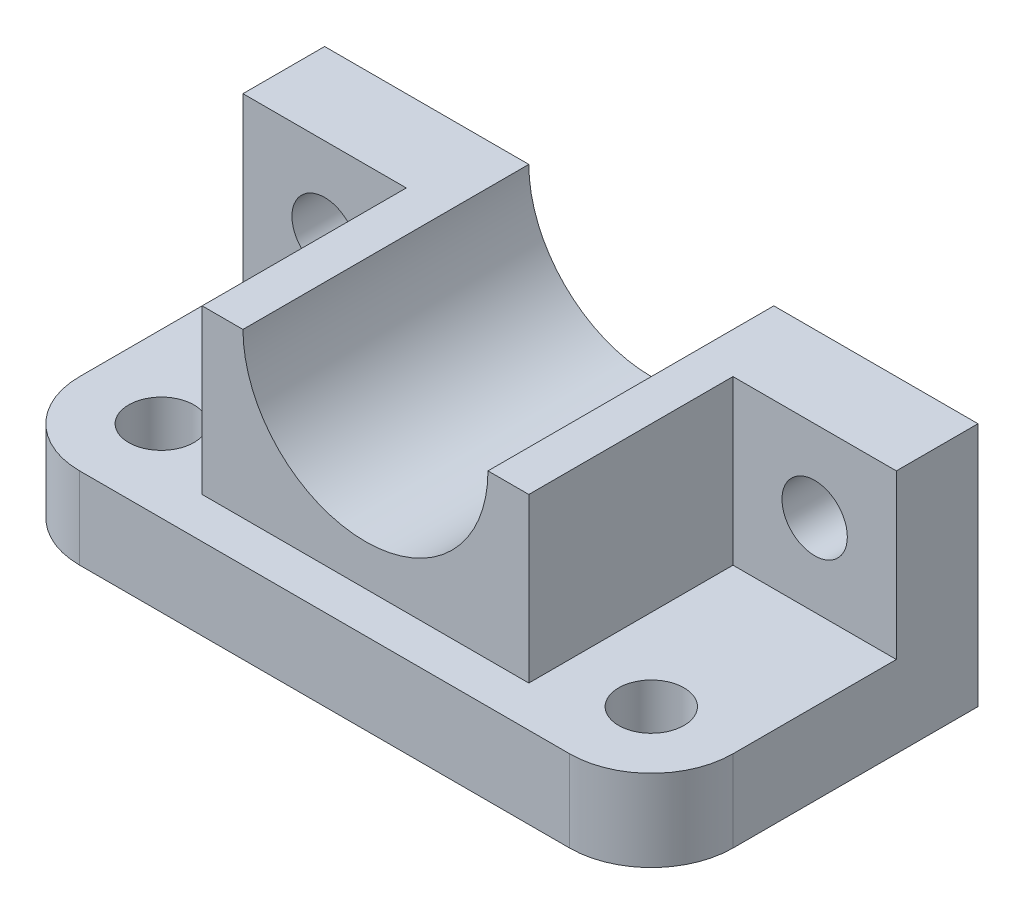
ISO-10303-21;
HEADER;
FILE_DESCRIPTION(('STEP AP214'),'2;1');
FILE_NAME('part.step','',(''),(''),'','','');
FILE_SCHEMA(('AUTOMOTIVE_DESIGN { 1 0 10303 214 1 1 1 1 }'));
ENDSEC;
DATA;
#1=APPLICATION_CONTEXT('core data for automotive mechanical design processes');
#2=APPLICATION_PROTOCOL_DEFINITION('international standard','automotive_design',2000,#1);
#3=PRODUCT_CONTEXT('',#1,'mechanical');
#4=PRODUCT('Part','Part','',(#3));
#5=PRODUCT_RELATED_PRODUCT_CATEGORY('part','',(#4));
#6=PRODUCT_DEFINITION_FORMATION('','',#4);
#7=PRODUCT_DEFINITION_CONTEXT('part definition',#1,'design');
#8=PRODUCT_DEFINITION('design','',#6,#7);
#9=PRODUCT_DEFINITION_SHAPE('','',#8);
#10=(LENGTH_UNIT() NAMED_UNIT(*) SI_UNIT(.MILLI.,.METRE.));
#11=(NAMED_UNIT(*) PLANE_ANGLE_UNIT() SI_UNIT($,.RADIAN.));
#12=(NAMED_UNIT(*) SI_UNIT($,.STERADIAN.) SOLID_ANGLE_UNIT());
#13=UNCERTAINTY_MEASURE_WITH_UNIT(LENGTH_MEASURE(1.E-05),#10,'distance_accuracy_value','');
#14=(GEOMETRIC_REPRESENTATION_CONTEXT(3) GLOBAL_UNCERTAINTY_ASSIGNED_CONTEXT((#13)) GLOBAL_UNIT_ASSIGNED_CONTEXT((#10,
#11,#12)) REPRESENTATION_CONTEXT('',''));
#15=CARTESIAN_POINT('',(0.,0.,0.));
#16=DIRECTION('',(0.,0.,1.));
#17=DIRECTION('',(1.,0.,0.));
#18=AXIS2_PLACEMENT_3D('',#15,#16,#17);
#19=CARTESIAN_POINT('',(-30.,10.,10.));
#20=DIRECTION('',(0.,-1.,0.));
#21=DIRECTION('',(0.,0.,-1.));
#22=AXIS2_PLACEMENT_3D('',#19,#20,#21);
#23=PLANE('',#22);
#24=CARTESIAN_POINT('',(-30.,10.,10.));
#25=DIRECTION('',(0.,1.,0.));
#26=DIRECTION('',(0.,0.,1.));
#27=AXIS2_PLACEMENT_3D('',#24,#25,#26);
#28=CIRCLE('',#27,4.);
#29=CARTESIAN_POINT('',(-30.,10.,14.));
#30=VERTEX_POINT('',#29);
#31=EDGE_CURVE('E225',#30,#30,#28,.T.);
#32=ORIENTED_EDGE('',*,*,#31,.F.);
#33=EDGE_LOOP('',(#32));
#34=FACE_BOUND('',#33,.T.);
#35=CARTESIAN_POINT('',(30.,10.,10.));
#36=DIRECTION('',(0.,1.,0.));
#37=DIRECTION('',(0.,0.,1.));
#38=AXIS2_PLACEMENT_3D('',#35,#36,#37);
#39=CIRCLE('',#38,4.);
#40=CARTESIAN_POINT('',(30.,10.,14.));
#41=VERTEX_POINT('',#40);
#42=EDGE_CURVE('E218',#41,#41,#39,.T.);
#43=ORIENTED_EDGE('',*,*,#42,.F.);
#44=EDGE_LOOP('',(#43));
#45=FACE_BOUND('',#44,.T.);
#46=DIRECTION('',(0.,0.,-1.));
#47=VECTOR('',#46,1.);
#48=CARTESIAN_POINT('',(-20.,10.,15.));
#49=LINE('',#48,#47);
#50=CARTESIAN_POINT('',(-20.,10.,15.));
#51=VERTEX_POINT('',#50);
#52=CARTESIAN_POINT('',(-20.,10.,-10.));
#53=VERTEX_POINT('',#52);
#54=EDGE_CURVE('E188',#51,#53,#49,.T.);
#55=ORIENTED_EDGE('',*,*,#54,.T.);
#56=DIRECTION('',(1.,0.,0.));
#57=VECTOR('',#56,1.);
#58=CARTESIAN_POINT('',(-30.,10.,-10.));
#59=LINE('',#58,#57);
#60=CARTESIAN_POINT('',(-40.,10.,-10.));
#61=VERTEX_POINT('',#60);
#62=EDGE_CURVE('E63',#61,#53,#59,.T.);
#63=ORIENTED_EDGE('',*,*,#62,.F.);
#64=DIRECTION('',(0.,0.,1.));
#65=VECTOR('',#64,1.);
#66=CARTESIAN_POINT('',(-40.,10.,9.99999999999993));
#67=LINE('',#66,#65);
#68=CARTESIAN_POINT('',(-40.,10.,9.99999999999993));
#69=VERTEX_POINT('',#68);
#70=EDGE_CURVE('E232',#61,#69,#67,.T.);
#71=ORIENTED_EDGE('',*,*,#70,.T.);
#72=CARTESIAN_POINT('',(-30.,10.,10.));
#73=DIRECTION('',(0.,1.,0.));
#74=DIRECTION('',(0.,0.,-1.));
#75=AXIS2_PLACEMENT_3D('',#72,#73,#74);
#76=CIRCLE('',#75,10.);
#77=CARTESIAN_POINT('',(-29.9999999999999,10.,20.));
#78=VERTEX_POINT('',#77);
#79=EDGE_CURVE('E235',#69,#78,#76,.T.);
#80=ORIENTED_EDGE('',*,*,#79,.T.);
#81=DIRECTION('',(1.,0.,0.));
#82=VECTOR('',#81,1.);
#83=CARTESIAN_POINT('',(-29.9999999999999,10.,20.));
#84=LINE('',#83,#82);
#85=CARTESIAN_POINT('',(29.9999999999999,10.,20.));
#86=VERTEX_POINT('',#85);
#87=EDGE_CURVE('E237',#78,#86,#84,.T.);
#88=ORIENTED_EDGE('',*,*,#87,.T.);
#89=CARTESIAN_POINT('',(30.,10.,10.));
#90=DIRECTION('',(0.,1.,0.));
#91=DIRECTION('',(0.,0.,-1.));
#92=AXIS2_PLACEMENT_3D('',#89,#90,#91);
#93=CIRCLE('',#92,10.);
#94=CARTESIAN_POINT('',(40.,10.,9.99999999999992));
#95=VERTEX_POINT('',#94);
#96=EDGE_CURVE('E239',#86,#95,#93,.T.);
#97=ORIENTED_EDGE('',*,*,#96,.T.);
#98=DIRECTION('',(0.,0.,-1.));
#99=VECTOR('',#98,1.);
#100=CARTESIAN_POINT('',(40.,10.,9.99999999999993));
#101=LINE('',#100,#99);
#102=CARTESIAN_POINT('',(40.,10.,-10.));
#103=VERTEX_POINT('',#102);
#104=EDGE_CURVE('E56',#95,#103,#101,.T.);
#105=ORIENTED_EDGE('',*,*,#104,.T.);
#106=CARTESIAN_POINT('',(20.,10.,-10.));
#107=VERTEX_POINT('',#106);
#108=EDGE_CURVE('E215',#107,#103,#59,.T.);
#109=ORIENTED_EDGE('',*,*,#108,.F.);
#110=DIRECTION('',(0.,0.,-1.));
#111=VECTOR('',#110,1.);
#112=CARTESIAN_POINT('',(20.,10.,15.));
#113=LINE('',#112,#111);
#114=CARTESIAN_POINT('',(20.,10.,15.));
#115=VERTEX_POINT('',#114);
#116=EDGE_CURVE('E190',#115,#107,#113,.T.);
#117=ORIENTED_EDGE('',*,*,#116,.F.);
#118=DIRECTION('',(1.,0.,0.));
#119=VECTOR('',#118,1.);
#120=CARTESIAN_POINT('',(0.,10.,15.));
#121=LINE('',#120,#119);
#122=EDGE_CURVE('E180',#51,#115,#121,.T.);
#123=ORIENTED_EDGE('',*,*,#122,.F.);
#124=EDGE_LOOP('',(#55,#63,#71,#80,#88,#97,#105,#109,#117,#123));
#125=FACE_BOUND('',#124,.T.);
#126=ADVANCED_FACE('F41',(#34,#45,#125),#23,.F.);
#127=CARTESIAN_POINT('',(-30.,0.,10.));
#128=DIRECTION('',(0.,-1.,0.));
#129=DIRECTION('',(0.,0.,-1.));
#130=AXIS2_PLACEMENT_3D('',#127,#128,#129);
#131=PLANE('',#130);
#132=DIRECTION('',(-1.,0.,0.));
#133=VECTOR('',#132,1.);
#134=CARTESIAN_POINT('',(-40.,0.,-20.));
#135=LINE('',#134,#133);
#136=CARTESIAN_POINT('',(40.,0.,-20.));
#137=VERTEX_POINT('',#136);
#138=CARTESIAN_POINT('',(-40.,0.,-20.));
#139=VERTEX_POINT('',#138);
#140=EDGE_CURVE('E243',#137,#139,#135,.T.);
#141=ORIENTED_EDGE('',*,*,#140,.F.);
#142=DIRECTION('',(0.,0.,-1.));
#143=VECTOR('',#142,1.);
#144=CARTESIAN_POINT('',(40.,0.,9.99999999999993));
#145=LINE('',#144,#143);
#146=CARTESIAN_POINT('',(40.,0.,9.99999999999992));
#147=VERTEX_POINT('',#146);
#148=EDGE_CURVE('E228',#147,#137,#145,.T.);
#149=ORIENTED_EDGE('',*,*,#148,.F.);
#150=CARTESIAN_POINT('',(30.,0.,10.));
#151=DIRECTION('',(0.,1.,0.));
#152=DIRECTION('',(0.,0.,-1.));
#153=AXIS2_PLACEMENT_3D('',#150,#151,#152);
#154=CIRCLE('',#153,10.);
#155=CARTESIAN_POINT('',(29.9999999999999,0.,20.));
#156=VERTEX_POINT('',#155);
#157=EDGE_CURVE('E233',#156,#147,#154,.T.);
#158=ORIENTED_EDGE('',*,*,#157,.F.);
#159=DIRECTION('',(1.,0.,0.));
#160=VECTOR('',#159,1.);
#161=CARTESIAN_POINT('',(-29.9999999999999,0.,20.));
#162=LINE('',#161,#160);
#163=CARTESIAN_POINT('',(-29.9999999999999,0.,20.));
#164=VERTEX_POINT('',#163);
#165=EDGE_CURVE('E249',#164,#156,#162,.T.);
#166=ORIENTED_EDGE('',*,*,#165,.F.);
#167=CARTESIAN_POINT('',(-30.,0.,10.));
#168=DIRECTION('',(0.,1.,0.));
#169=DIRECTION('',(0.,0.,-1.));
#170=AXIS2_PLACEMENT_3D('',#167,#168,#169);
#171=CIRCLE('',#170,10.);
#172=CARTESIAN_POINT('',(-40.,0.,9.99999999999993));
#173=VERTEX_POINT('',#172);
#174=EDGE_CURVE('E247',#173,#164,#171,.T.);
#175=ORIENTED_EDGE('',*,*,#174,.F.);
#176=DIRECTION('',(0.,0.,1.));
#177=VECTOR('',#176,1.);
#178=CARTESIAN_POINT('',(-40.,0.,9.99999999999993));
#179=LINE('',#178,#177);
#180=EDGE_CURVE('E245',#139,#173,#179,.T.);
#181=ORIENTED_EDGE('',*,*,#180,.F.);
#182=EDGE_LOOP('',(#141,#149,#158,#166,#175,#181));
#183=FACE_BOUND('',#182,.T.);
#184=CARTESIAN_POINT('',(-30.,0.,10.));
#185=DIRECTION('',(0.,1.,0.));
#186=DIRECTION('',(0.,0.,1.));
#187=AXIS2_PLACEMENT_3D('',#184,#185,#186);
#188=CIRCLE('',#187,4.);
#189=CARTESIAN_POINT('',(-30.,0.,14.));
#190=VERTEX_POINT('',#189);
#191=EDGE_CURVE('E221',#190,#190,#188,.T.);
#192=ORIENTED_EDGE('',*,*,#191,.T.);
#193=EDGE_LOOP('',(#192));
#194=FACE_BOUND('',#193,.T.);
#195=CARTESIAN_POINT('',(30.,0.,10.));
#196=DIRECTION('',(0.,1.,0.));
#197=DIRECTION('',(0.,0.,1.));
#198=AXIS2_PLACEMENT_3D('',#195,#196,#197);
#199=CIRCLE('',#198,4.);
#200=CARTESIAN_POINT('',(30.,0.,14.));
#201=VERTEX_POINT('',#200);
#202=EDGE_CURVE('E222',#201,#201,#199,.T.);
#203=ORIENTED_EDGE('',*,*,#202,.T.);
#204=EDGE_LOOP('',(#203));
#205=FACE_BOUND('',#204,.T.);
#206=ADVANCED_FACE('F273',(#183,#194,#205),#131,.T.);
#207=CARTESIAN_POINT('',(40.,10.,9.99999999999993));
#208=DIRECTION('',(-1.,0.,0.));
#209=DIRECTION('',(0.,0.,1.));
#210=AXIS2_PLACEMENT_3D('',#207,#208,#209);
#211=PLANE('',#210);
#212=DIRECTION('',(0.,-1.,0.));
#213=VECTOR('',#212,1.);
#214=CARTESIAN_POINT('',(40.,10.,-20.));
#215=LINE('',#214,#213);
#216=CARTESIAN_POINT('',(40.,30.,-20.));
#217=VERTEX_POINT('',#216);
#218=EDGE_CURVE('E11',#217,#137,#215,.T.);
#219=ORIENTED_EDGE('',*,*,#218,.F.);
#220=DIRECTION('',(0.,0.,-1.));
#221=VECTOR('',#220,1.);
#222=CARTESIAN_POINT('',(40.,30.,-10.));
#223=LINE('',#222,#221);
#224=CARTESIAN_POINT('',(40.,30.,-10.));
#225=VERTEX_POINT('',#224);
#226=EDGE_CURVE('E209',#225,#217,#223,.T.);
#227=ORIENTED_EDGE('',*,*,#226,.F.);
#228=DIRECTION('',(0.,1.,0.));
#229=VECTOR('',#228,1.);
#230=CARTESIAN_POINT('',(40.,0.,-10.));
#231=LINE('',#230,#229);
#232=EDGE_CURVE('E200',#103,#225,#231,.T.);
#233=ORIENTED_EDGE('',*,*,#232,.F.);
#234=ORIENTED_EDGE('',*,*,#104,.F.);
#235=DIRECTION('',(0.,-1.,0.));
#236=VECTOR('',#235,1.);
#237=CARTESIAN_POINT('',(40.,10.,9.99999999999992));
#238=LINE('',#237,#236);
#239=EDGE_CURVE('E241',#95,#147,#238,.T.);
#240=ORIENTED_EDGE('',*,*,#239,.T.);
#241=ORIENTED_EDGE('',*,*,#148,.T.);
#242=EDGE_LOOP('',(#219,#227,#233,#234,#240,#241));
#243=FACE_BOUND('',#242,.T.);
#244=ADVANCED_FACE('F43',(#243),#211,.F.);
#245=CARTESIAN_POINT('',(-40.,10.,-20.));
#246=DIRECTION('',(0.,0.,1.));
#247=DIRECTION('',(1.,0.,0.));
#248=AXIS2_PLACEMENT_3D('',#245,#246,#247);
#249=PLANE('',#248);
#250=CARTESIAN_POINT('',(30.,20.,-20.));
#251=DIRECTION('',(0.,0.,1.));
#252=DIRECTION('',(1.,0.,0.));
#253=AXIS2_PLACEMENT_3D('',#250,#251,#252);
#254=CIRCLE('',#253,4.00000000000001);
#255=CARTESIAN_POINT('',(34.,20.,-20.));
#256=VERTEX_POINT('',#255);
#257=EDGE_CURVE('E173',#256,#256,#254,.T.);
#258=ORIENTED_EDGE('',*,*,#257,.T.);
#259=EDGE_LOOP('',(#258));
#260=FACE_BOUND('',#259,.T.);
#261=CARTESIAN_POINT('',(-30.,20.,-20.));
#262=DIRECTION('',(0.,0.,1.));
#263=DIRECTION('',(-1.,0.,0.));
#264=AXIS2_PLACEMENT_3D('',#261,#262,#263);
#265=CIRCLE('',#264,4.00000000000001);
#266=CARTESIAN_POINT('',(-34.,20.,-20.));
#267=VERTEX_POINT('',#266);
#268=EDGE_CURVE('E176',#267,#267,#265,.T.);
#269=ORIENTED_EDGE('',*,*,#268,.T.);
#270=EDGE_LOOP('',(#269));
#271=FACE_BOUND('',#270,.T.);
#272=ORIENTED_EDGE('',*,*,#140,.T.);
#273=DIRECTION('',(0.,-1.,0.));
#274=VECTOR('',#273,1.);
#275=CARTESIAN_POINT('',(-40.,10.,-20.));
#276=LINE('',#275,#274);
#277=CARTESIAN_POINT('',(-40.,30.,-20.));
#278=VERTEX_POINT('',#277);
#279=EDGE_CURVE('E49',#278,#139,#276,.T.);
#280=ORIENTED_EDGE('',*,*,#279,.F.);
#281=DIRECTION('',(1.,0.,0.));
#282=VECTOR('',#281,1.);
#283=CARTESIAN_POINT('',(0.,30.,-20.));
#284=LINE('',#283,#282);
#285=CARTESIAN_POINT('',(-15.,30.,-20.));
#286=VERTEX_POINT('',#285);
#287=EDGE_CURVE('E197',#278,#286,#284,.T.);
#288=ORIENTED_EDGE('',*,*,#287,.T.);
#289=CARTESIAN_POINT('',(0.,30.,-20.));
#290=DIRECTION('',(0.,0.,-1.));
#291=DIRECTION('',(-1.,0.,0.));
#292=AXIS2_PLACEMENT_3D('',#289,#290,#291);
#293=CIRCLE('',#292,15.);
#294=CARTESIAN_POINT('',(15.,30.,-20.));
#295=VERTEX_POINT('',#294);
#296=EDGE_CURVE('E171',#295,#286,#293,.T.);
#297=ORIENTED_EDGE('',*,*,#296,.F.);
#298=DIRECTION('',(-1.,0.,0.));
#299=VECTOR('',#298,1.);
#300=CARTESIAN_POINT('',(0.,30.,-20.));
#301=LINE('',#300,#299);
#302=EDGE_CURVE('E160',#217,#295,#301,.T.);
#303=ORIENTED_EDGE('',*,*,#302,.F.);
#304=ORIENTED_EDGE('',*,*,#218,.T.);
#305=EDGE_LOOP('',(#272,#280,#288,#297,#303,#304));
#306=FACE_BOUND('',#305,.T.);
#307=ADVANCED_FACE('F296',(#260,#271,#306),#249,.F.);
#308=CARTESIAN_POINT('',(-40.,10.,9.99999999999993));
#309=DIRECTION('',(1.,0.,0.));
#310=DIRECTION('',(0.,0.,-1.));
#311=AXIS2_PLACEMENT_3D('',#308,#309,#310);
#312=PLANE('',#311);
#313=ORIENTED_EDGE('',*,*,#180,.T.);
#314=DIRECTION('',(0.,-1.,0.));
#315=VECTOR('',#314,1.);
#316=CARTESIAN_POINT('',(-40.,10.,9.99999999999993));
#317=LINE('',#316,#315);
#318=EDGE_CURVE('E260',#69,#173,#317,.T.);
#319=ORIENTED_EDGE('',*,*,#318,.F.);
#320=ORIENTED_EDGE('',*,*,#70,.F.);
#321=DIRECTION('',(0.,1.,0.));
#322=VECTOR('',#321,1.);
#323=CARTESIAN_POINT('',(-40.,0.,-10.));
#324=LINE('',#323,#322);
#325=CARTESIAN_POINT('',(-40.,30.,-10.));
#326=VERTEX_POINT('',#325);
#327=EDGE_CURVE('E202',#61,#326,#324,.T.);
#328=ORIENTED_EDGE('',*,*,#327,.T.);
#329=DIRECTION('',(0.,0.,-1.));
#330=VECTOR('',#329,1.);
#331=CARTESIAN_POINT('',(-40.,30.,-10.));
#332=LINE('',#331,#330);
#333=EDGE_CURVE('E212',#326,#278,#332,.T.);
#334=ORIENTED_EDGE('',*,*,#333,.T.);
#335=ORIENTED_EDGE('',*,*,#279,.T.);
#336=EDGE_LOOP('',(#313,#319,#320,#328,#334,#335));
#337=FACE_BOUND('',#336,.T.);
#338=ADVANCED_FACE('F265',(#337),#312,.F.);
#339=CARTESIAN_POINT('',(-30.,10.,10.));
#340=DIRECTION('',(0.,-1.,0.));
#341=DIRECTION('',(0.,0.,-1.));
#342=AXIS2_PLACEMENT_3D('',#339,#340,#341);
#343=CYLINDRICAL_SURFACE('',#342,10.);
#344=ORIENTED_EDGE('',*,*,#174,.T.);
#345=DIRECTION('',(0.,-1.,0.));
#346=VECTOR('',#345,1.);
#347=CARTESIAN_POINT('',(-29.9999999999999,10.,20.));
#348=LINE('',#347,#346);
#349=EDGE_CURVE('E257',#78,#164,#348,.T.);
#350=ORIENTED_EDGE('',*,*,#349,.F.);
#351=ORIENTED_EDGE('',*,*,#79,.F.);
#352=ORIENTED_EDGE('',*,*,#318,.T.);
#353=EDGE_LOOP('',(#344,#350,#351,#352));
#354=FACE_BOUND('',#353,.T.);
#355=ADVANCED_FACE('F280',(#354),#343,.T.);
#356=CARTESIAN_POINT('',(-29.9999999999999,10.,20.));
#357=DIRECTION('',(0.,0.,-1.));
#358=DIRECTION('',(-1.,0.,0.));
#359=AXIS2_PLACEMENT_3D('',#356,#357,#358);
#360=PLANE('',#359);
#361=ORIENTED_EDGE('',*,*,#165,.T.);
#362=DIRECTION('',(0.,-1.,0.));
#363=VECTOR('',#362,1.);
#364=CARTESIAN_POINT('',(29.9999999999999,10.,20.));
#365=LINE('',#364,#363);
#366=EDGE_CURVE('E254',#86,#156,#365,.T.);
#367=ORIENTED_EDGE('',*,*,#366,.F.);
#368=ORIENTED_EDGE('',*,*,#87,.F.);
#369=ORIENTED_EDGE('',*,*,#349,.T.);
#370=EDGE_LOOP('',(#361,#367,#368,#369));
#371=FACE_BOUND('',#370,.T.);
#372=ADVANCED_FACE('F284',(#371),#360,.F.);
#373=CARTESIAN_POINT('',(30.,10.,10.));
#374=DIRECTION('',(0.,-1.,0.));
#375=DIRECTION('',(0.,0.,-1.));
#376=AXIS2_PLACEMENT_3D('',#373,#374,#375);
#377=CYLINDRICAL_SURFACE('',#376,10.);
#378=ORIENTED_EDGE('',*,*,#157,.T.);
#379=ORIENTED_EDGE('',*,*,#239,.F.);
#380=ORIENTED_EDGE('',*,*,#96,.F.);
#381=ORIENTED_EDGE('',*,*,#366,.T.);
#382=EDGE_LOOP('',(#378,#379,#380,#381));
#383=FACE_BOUND('',#382,.T.);
#384=ADVANCED_FACE('F304',(#383),#377,.T.);
#385=CARTESIAN_POINT('',(-30.,10.,10.));
#386=DIRECTION('',(0.,-1.,0.));
#387=DIRECTION('',(0.,0.,-1.));
#388=AXIS2_PLACEMENT_3D('',#385,#386,#387);
#389=CYLINDRICAL_SURFACE('',#388,4.);
#390=ORIENTED_EDGE('',*,*,#31,.T.);
#391=EDGE_LOOP('',(#390));
#392=FACE_BOUND('',#391,.T.);
#393=ORIENTED_EDGE('',*,*,#191,.F.);
#394=EDGE_LOOP('',(#393));
#395=FACE_BOUND('',#394,.T.);
#396=ADVANCED_FACE('F306',(#392,#395),#389,.F.);
#397=CARTESIAN_POINT('',(30.,10.,10.));
#398=DIRECTION('',(0.,-1.,0.));
#399=DIRECTION('',(0.,0.,-1.));
#400=AXIS2_PLACEMENT_3D('',#397,#398,#399);
#401=CYLINDRICAL_SURFACE('',#400,4.);
#402=ORIENTED_EDGE('',*,*,#42,.T.);
#403=EDGE_LOOP('',(#402));
#404=FACE_BOUND('',#403,.T.);
#405=ORIENTED_EDGE('',*,*,#202,.F.);
#406=EDGE_LOOP('',(#405));
#407=FACE_BOUND('',#406,.T.);
#408=ADVANCED_FACE('F312',(#404,#407),#401,.F.);
#409=CARTESIAN_POINT('',(0.,30.,-10.));
#410=DIRECTION('',(0.,-1.,0.));
#411=DIRECTION('',(0.,0.,-1.));
#412=AXIS2_PLACEMENT_3D('',#409,#410,#411);
#413=PLANE('',#412);
#414=ORIENTED_EDGE('',*,*,#302,.T.);
#415=DIRECTION('',(0.,0.,-1.));
#416=VECTOR('',#415,1.);
#417=CARTESIAN_POINT('',(15.,30.,15.));
#418=LINE('',#417,#416);
#419=CARTESIAN_POINT('',(15.,30.,15.));
#420=VERTEX_POINT('',#419);
#421=EDGE_CURVE('E156',#420,#295,#418,.T.);
#422=ORIENTED_EDGE('',*,*,#421,.F.);
#423=DIRECTION('',(-1.,0.,0.));
#424=VECTOR('',#423,1.);
#425=CARTESIAN_POINT('',(0.,30.,15.));
#426=LINE('',#425,#424);
#427=CARTESIAN_POINT('',(20.,30.,15.));
#428=VERTEX_POINT('',#427);
#429=EDGE_CURVE('E143',#428,#420,#426,.T.);
#430=ORIENTED_EDGE('',*,*,#429,.F.);
#431=DIRECTION('',(0.,0.,-1.));
#432=VECTOR('',#431,1.);
#433=CARTESIAN_POINT('',(20.,30.,15.));
#434=LINE('',#433,#432);
#435=CARTESIAN_POINT('',(20.,30.,-10.));
#436=VERTEX_POINT('',#435);
#437=EDGE_CURVE('E164',#428,#436,#434,.T.);
#438=ORIENTED_EDGE('',*,*,#437,.T.);
#439=DIRECTION('',(-1.,0.,0.));
#440=VECTOR('',#439,1.);
#441=CARTESIAN_POINT('',(0.,30.,-10.));
#442=LINE('',#441,#440);
#443=EDGE_CURVE('E196',#225,#436,#442,.T.);
#444=ORIENTED_EDGE('',*,*,#443,.F.);
#445=ORIENTED_EDGE('',*,*,#226,.T.);
#446=EDGE_LOOP('',(#414,#422,#430,#438,#444,#445));
#447=FACE_BOUND('',#446,.T.);
#448=ADVANCED_FACE('F157',(#447),#413,.F.);
#449=CARTESIAN_POINT('',(0.,0.,-10.));
#450=DIRECTION('',(0.,0.,-1.));
#451=DIRECTION('',(-1.,0.,0.));
#452=AXIS2_PLACEMENT_3D('',#449,#450,#451);
#453=PLANE('',#452);
#454=CARTESIAN_POINT('',(30.,20.,-10.));
#455=DIRECTION('',(0.,0.,1.));
#456=DIRECTION('',(1.,0.,0.));
#457=AXIS2_PLACEMENT_3D('',#454,#455,#456);
#458=CIRCLE('',#457,4.00000000000001);
#459=CARTESIAN_POINT('',(34.,20.,-10.));
#460=VERTEX_POINT('',#459);
#461=EDGE_CURVE('E363',#460,#460,#458,.T.);
#462=ORIENTED_EDGE('',*,*,#461,.F.);
#463=EDGE_LOOP('',(#462));
#464=FACE_BOUND('',#463,.T.);
#465=DIRECTION('',(0.,-1.,0.));
#466=VECTOR('',#465,1.);
#467=CARTESIAN_POINT('',(20.,0.,-10.));
#468=LINE('',#467,#466);
#469=EDGE_CURVE('E193',#436,#107,#468,.T.);
#470=ORIENTED_EDGE('',*,*,#469,.T.);
#471=ORIENTED_EDGE('',*,*,#108,.T.);
#472=ORIENTED_EDGE('',*,*,#232,.T.);
#473=ORIENTED_EDGE('',*,*,#443,.T.);
#474=EDGE_LOOP('',(#470,#471,#472,#473));
#475=FACE_BOUND('',#474,.T.);
#476=ADVANCED_FACE('F302',(#464,#475),#453,.F.);
#477=CARTESIAN_POINT('',(-30.,20.,-10.));
#478=DIRECTION('',(0.,0.,1.));
#479=DIRECTION('',(-1.,0.,0.));
#480=AXIS2_PLACEMENT_3D('',#477,#478,#479);
#481=CIRCLE('',#480,4.00000000000001);
#482=CARTESIAN_POINT('',(-34.,20.,-10.));
#483=VERTEX_POINT('',#482);
#484=EDGE_CURVE('E365',#483,#483,#481,.T.);
#485=ORIENTED_EDGE('',*,*,#484,.F.);
#486=EDGE_LOOP('',(#485));
#487=FACE_BOUND('',#486,.T.);
#488=ORIENTED_EDGE('',*,*,#327,.F.);
#489=ORIENTED_EDGE('',*,*,#62,.T.);
#490=DIRECTION('',(0.,-1.,0.));
#491=VECTOR('',#490,1.);
#492=CARTESIAN_POINT('',(-20.,0.,-10.));
#493=LINE('',#492,#491);
#494=CARTESIAN_POINT('',(-20.,30.,-10.));
#495=VERTEX_POINT('',#494);
#496=EDGE_CURVE('E207',#495,#53,#493,.T.);
#497=ORIENTED_EDGE('',*,*,#496,.F.);
#498=DIRECTION('',(1.,0.,0.));
#499=VECTOR('',#498,1.);
#500=CARTESIAN_POINT('',(0.,30.,-10.));
#501=LINE('',#500,#499);
#502=EDGE_CURVE('E204',#326,#495,#501,.T.);
#503=ORIENTED_EDGE('',*,*,#502,.F.);
#504=EDGE_LOOP('',(#488,#489,#497,#503));
#505=FACE_BOUND('',#504,.T.);
#506=ADVANCED_FACE('F291',(#487,#505),#453,.F.);
#507=CARTESIAN_POINT('',(0.,30.,-10.));
#508=DIRECTION('',(0.,1.,0.));
#509=DIRECTION('',(0.,0.,1.));
#510=AXIS2_PLACEMENT_3D('',#507,#508,#509);
#511=PLANE('',#510);
#512=ORIENTED_EDGE('',*,*,#287,.F.);
#513=ORIENTED_EDGE('',*,*,#333,.F.);
#514=ORIENTED_EDGE('',*,*,#502,.T.);
#515=DIRECTION('',(0.,0.,-1.));
#516=VECTOR('',#515,1.);
#517=CARTESIAN_POINT('',(-20.,30.,15.));
#518=LINE('',#517,#516);
#519=CARTESIAN_POINT('',(-20.,30.,15.));
#520=VERTEX_POINT('',#519);
#521=EDGE_CURVE('E186',#520,#495,#518,.T.);
#522=ORIENTED_EDGE('',*,*,#521,.F.);
#523=DIRECTION('',(1.,0.,0.));
#524=VECTOR('',#523,1.);
#525=CARTESIAN_POINT('',(0.,30.,15.));
#526=LINE('',#525,#524);
#527=CARTESIAN_POINT('',(-15.,30.,15.));
#528=VERTEX_POINT('',#527);
#529=EDGE_CURVE('E165',#520,#528,#526,.T.);
#530=ORIENTED_EDGE('',*,*,#529,.T.);
#531=DIRECTION('',(0.,0.,-1.));
#532=VECTOR('',#531,1.);
#533=CARTESIAN_POINT('',(-15.,30.,15.));
#534=LINE('',#533,#532);
#535=EDGE_CURVE('E169',#528,#286,#534,.T.);
#536=ORIENTED_EDGE('',*,*,#535,.T.);
#537=EDGE_LOOP('',(#512,#513,#514,#522,#530,#536));
#538=FACE_BOUND('',#537,.T.);
#539=ADVANCED_FACE('F294',(#538),#511,.T.);
#540=CARTESIAN_POINT('',(20.,0.,15.));
#541=DIRECTION('',(1.,0.,0.));
#542=DIRECTION('',(0.,0.,-1.));
#543=AXIS2_PLACEMENT_3D('',#540,#541,#542);
#544=PLANE('',#543);
#545=ORIENTED_EDGE('',*,*,#469,.F.);
#546=ORIENTED_EDGE('',*,*,#437,.F.);
#547=DIRECTION('',(0.,-1.,0.));
#548=VECTOR('',#547,1.);
#549=CARTESIAN_POINT('',(20.,0.,15.));
#550=LINE('',#549,#548);
#551=EDGE_CURVE('E151',#428,#115,#550,.T.);
#552=ORIENTED_EDGE('',*,*,#551,.T.);
#553=ORIENTED_EDGE('',*,*,#116,.T.);
#554=EDGE_LOOP('',(#545,#546,#552,#553));
#555=FACE_BOUND('',#554,.T.);
#556=ADVANCED_FACE('F334',(#555),#544,.T.);
#557=CARTESIAN_POINT('',(-20.,0.,15.));
#558=DIRECTION('',(1.,0.,0.));
#559=DIRECTION('',(0.,1.,0.));
#560=AXIS2_PLACEMENT_3D('',#557,#558,#559);
#561=PLANE('',#560);
#562=ORIENTED_EDGE('',*,*,#521,.T.);
#563=ORIENTED_EDGE('',*,*,#496,.T.);
#564=ORIENTED_EDGE('',*,*,#54,.F.);
#565=DIRECTION('',(0.,-1.,0.));
#566=VECTOR('',#565,1.);
#567=CARTESIAN_POINT('',(-20.,0.,15.));
#568=LINE('',#567,#566);
#569=EDGE_CURVE('E182',#520,#51,#568,.T.);
#570=ORIENTED_EDGE('',*,*,#569,.F.);
#571=EDGE_LOOP('',(#562,#563,#564,#570));
#572=FACE_BOUND('',#571,.T.);
#573=ADVANCED_FACE('F340',(#572),#561,.F.);
#574=CARTESIAN_POINT('',(0.,30.,15.));
#575=DIRECTION('',(0.,0.,-1.));
#576=DIRECTION('',(-1.,0.,0.));
#577=AXIS2_PLACEMENT_3D('',#574,#575,#576);
#578=CYLINDRICAL_SURFACE('',#577,15.);
#579=ORIENTED_EDGE('',*,*,#296,.T.);
#580=ORIENTED_EDGE('',*,*,#535,.F.);
#581=CARTESIAN_POINT('',(0.,30.,15.));
#582=DIRECTION('',(0.,0.,-1.));
#583=DIRECTION('',(-1.,0.,0.));
#584=AXIS2_PLACEMENT_3D('',#581,#582,#583);
#585=CIRCLE('',#584,15.);
#586=EDGE_CURVE('E148',#420,#528,#585,.T.);
#587=ORIENTED_EDGE('',*,*,#586,.F.);
#588=ORIENTED_EDGE('',*,*,#421,.T.);
#589=EDGE_LOOP('',(#579,#580,#587,#588));
#590=FACE_BOUND('',#589,.T.);
#591=ADVANCED_FACE('F167',(#590),#578,.F.);
#592=CARTESIAN_POINT('',(0.,0.,15.));
#593=DIRECTION('',(0.,0.,-1.));
#594=DIRECTION('',(-1.,0.,0.));
#595=AXIS2_PLACEMENT_3D('',#592,#593,#594);
#596=PLANE('',#595);
#597=ORIENTED_EDGE('',*,*,#586,.T.);
#598=ORIENTED_EDGE('',*,*,#529,.F.);
#599=ORIENTED_EDGE('',*,*,#569,.T.);
#600=ORIENTED_EDGE('',*,*,#122,.T.);
#601=ORIENTED_EDGE('',*,*,#551,.F.);
#602=ORIENTED_EDGE('',*,*,#429,.T.);
#603=EDGE_LOOP('',(#597,#598,#599,#600,#601,#602));
#604=FACE_BOUND('',#603,.T.);
#605=ADVANCED_FACE('F145',(#604),#596,.F.);
#606=CARTESIAN_POINT('',(-30.,20.,-20.));
#607=DIRECTION('',(0.,0.,1.));
#608=DIRECTION('',(1.,0.,0.));
#609=AXIS2_PLACEMENT_3D('',#606,#607,#608);
#610=CYLINDRICAL_SURFACE('',#609,4.00000000000001);
#611=ORIENTED_EDGE('',*,*,#268,.F.);
#612=EDGE_LOOP('',(#611));
#613=FACE_BOUND('',#612,.T.);
#614=ORIENTED_EDGE('',*,*,#484,.T.);
#615=EDGE_LOOP('',(#614));
#616=FACE_BOUND('',#615,.T.);
#617=ADVANCED_FACE('F349',(#613,#616),#610,.F.);
#618=CARTESIAN_POINT('',(30.,20.,-20.));
#619=DIRECTION('',(0.,0.,1.));
#620=DIRECTION('',(1.,0.,0.));
#621=AXIS2_PLACEMENT_3D('',#618,#619,#620);
#622=CYLINDRICAL_SURFACE('',#621,4.00000000000001);
#623=ORIENTED_EDGE('',*,*,#257,.F.);
#624=EDGE_LOOP('',(#623));
#625=FACE_BOUND('',#624,.T.);
#626=ORIENTED_EDGE('',*,*,#461,.T.);
#627=EDGE_LOOP('',(#626));
#628=FACE_BOUND('',#627,.T.);
#629=ADVANCED_FACE('F352',(#625,#628),#622,.F.);
#630=CLOSED_SHELL('',(#126,#206,#244,#307,#338,#355,#372,#384,#396,#408,#448,#476,#506,#539,
#556,#573,#591,#605,#617,#629));
#631=MANIFOLD_SOLID_BREP('B2',#630);
#632=ADVANCED_BREP_SHAPE_REPRESENTATION('',(#18,#631),#14);
#633=SHAPE_DEFINITION_REPRESENTATION(#9,#632);
ENDSEC;
END-ISO-10303-21;
